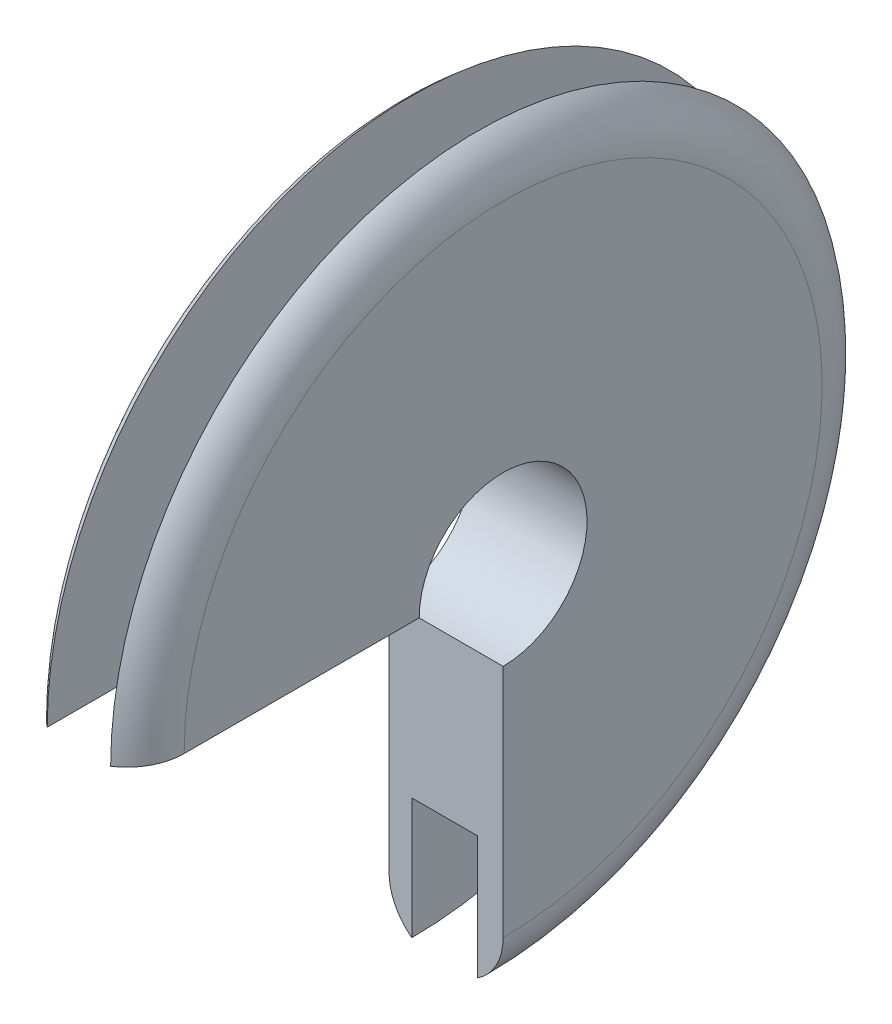
ISO-10303-21;
HEADER;
FILE_DESCRIPTION(('STEP AP214'),'2;1');
FILE_NAME('part.step','',(''),(''),'','','');
FILE_SCHEMA(('AUTOMOTIVE_DESIGN { 1 0 10303 214 1 1 1 1 }'));
ENDSEC;
DATA;
#1=APPLICATION_CONTEXT('core data for automotive mechanical design processes');
#2=APPLICATION_PROTOCOL_DEFINITION('international standard','automotive_design',2000,#1);
#3=PRODUCT_CONTEXT('',#1,'mechanical');
#4=PRODUCT('Part','Part','',(#3));
#5=PRODUCT_RELATED_PRODUCT_CATEGORY('part','',(#4));
#6=PRODUCT_DEFINITION_FORMATION('','',#4);
#7=PRODUCT_DEFINITION_CONTEXT('part definition',#1,'design');
#8=PRODUCT_DEFINITION('design','',#6,#7);
#9=PRODUCT_DEFINITION_SHAPE('','',#8);
#10=(LENGTH_UNIT() NAMED_UNIT(*) SI_UNIT(.MILLI.,.METRE.));
#11=(NAMED_UNIT(*) PLANE_ANGLE_UNIT() SI_UNIT($,.RADIAN.));
#12=(NAMED_UNIT(*) SI_UNIT($,.STERADIAN.) SOLID_ANGLE_UNIT());
#13=UNCERTAINTY_MEASURE_WITH_UNIT(LENGTH_MEASURE(1.E-05),#10,'distance_accuracy_value','');
#14=(GEOMETRIC_REPRESENTATION_CONTEXT(3) GLOBAL_UNCERTAINTY_ASSIGNED_CONTEXT((#13)) GLOBAL_UNIT_ASSIGNED_CONTEXT((#10,
#11,#12)) REPRESENTATION_CONTEXT('',''));
#15=CARTESIAN_POINT('',(0.,0.,0.));
#16=DIRECTION('',(0.,0.,1.));
#17=DIRECTION('',(1.,0.,0.));
#18=AXIS2_PLACEMENT_3D('',#15,#16,#17);
#19=CARTESIAN_POINT('',(0.,0.,0.));
#20=DIRECTION('',(-1.,0.,0.));
#21=DIRECTION('',(0.,0.,1.));
#22=AXIS2_PLACEMENT_3D('',#19,#20,#21);
#23=TOROIDAL_SURFACE('',#22,76.017373959772,13.5941620943285);
#24=CARTESIAN_POINT('',(-8.16366110818456,0.,0.));
#25=DIRECTION('',(1.,0.,0.));
#26=DIRECTION('',(0.,0.,-1.));
#27=AXIS2_PLACEMENT_3D('',#24,#25,#26);
#28=CIRCLE('',#27,86.8873270579962);
#29=CARTESIAN_POINT('',(-8.16366110818456,-86.8873270579962,3.03365481004954E-13));
#30=VERTEX_POINT('',#29);
#31=CARTESIAN_POINT('',(-8.16366110818456,-6.06730962009907E-13,86.8873270579962));
#32=VERTEX_POINT('',#31);
#33=EDGE_CURVE('E114',#30,#32,#28,.T.);
#34=ORIENTED_EDGE('',*,*,#33,.F.);
#35=CARTESIAN_POINT('',(0.,-76.017373959772,2.65413242608404E-13));
#36=DIRECTION('',(0.,0.,-1.));
#37=DIRECTION('',(0.,-1.,0.));
#38=AXIS2_PLACEMENT_3D('',#35,#36,#37);
#39=CIRCLE('',#38,13.5941620943285);
#40=CARTESIAN_POINT('',(-13.5941620943285,-76.0173739597721,2.65413242608404E-13));
#41=VERTEX_POINT('',#40);
#42=EDGE_CURVE('E135',#30,#41,#39,.T.);
#43=ORIENTED_EDGE('',*,*,#42,.T.);
#44=CARTESIAN_POINT('',(-13.5941620943285,0.,0.));
#45=DIRECTION('',(-1.,0.,0.));
#46=DIRECTION('',(0.,0.,1.));
#47=AXIS2_PLACEMENT_3D('',#44,#45,#46);
#48=CIRCLE('',#47,76.0173739597721);
#49=CARTESIAN_POINT('',(-13.5941620943285,-5.30826485216808E-13,76.0173739597721));
#50=VERTEX_POINT('',#49);
#51=EDGE_CURVE('E155',#50,#41,#48,.T.);
#52=ORIENTED_EDGE('',*,*,#51,.F.);
#53=CARTESIAN_POINT('',(0.,-5.30826485216808E-13,76.017373959772));
#54=DIRECTION('',(0.,-1.,0.));
#55=DIRECTION('',(0.,0.,1.));
#56=AXIS2_PLACEMENT_3D('',#53,#54,#55);
#57=CIRCLE('',#56,13.5941620943285);
#58=EDGE_CURVE('E146',#32,#50,#57,.T.);
#59=ORIENTED_EDGE('',*,*,#58,.F.);
#60=EDGE_LOOP('',(#34,#43,#52,#59));
#61=FACE_BOUND('',#60,.T.);
#62=ADVANCED_FACE('F37',(#61),#23,.T.);
#63=CARTESIAN_POINT('',(7.45377753355975,0.,0.));
#64=DIRECTION('',(-1.,0.,0.));
#65=DIRECTION('',(0.,0.,1.));
#66=AXIS2_PLACEMENT_3D('',#63,#64,#65);
#67=CIRCLE('',#66,87.3858586225174);
#68=CARTESIAN_POINT('',(7.45377753355975,-6.10212189318608E-13,87.3858586225174));
#69=VERTEX_POINT('',#68);
#70=CARTESIAN_POINT('',(7.45377753355975,-87.3858586225174,3.05106094659304E-13));
#71=VERTEX_POINT('',#70);
#72=EDGE_CURVE('E52',#69,#71,#67,.T.);
#73=ORIENTED_EDGE('',*,*,#72,.F.);
#74=CARTESIAN_POINT('',(13.5941620943285,-5.30826485216808E-13,76.0173739597721));
#75=VERTEX_POINT('',#74);
#76=EDGE_CURVE('E124',#75,#69,#57,.T.);
#77=ORIENTED_EDGE('',*,*,#76,.F.);
#78=CARTESIAN_POINT('',(13.5941620943285,0.,0.));
#79=DIRECTION('',(-1.,0.,0.));
#80=DIRECTION('',(0.,0.,1.));
#81=AXIS2_PLACEMENT_3D('',#78,#79,#80);
#82=CIRCLE('',#81,76.0173739597721);
#83=CARTESIAN_POINT('',(13.5941620943285,-76.0173739597721,2.65413242608404E-13));
#84=VERTEX_POINT('',#83);
#85=EDGE_CURVE('E153',#75,#84,#82,.T.);
#86=ORIENTED_EDGE('',*,*,#85,.T.);
#87=EDGE_CURVE('E136',#84,#71,#39,.T.);
#88=ORIENTED_EDGE('',*,*,#87,.T.);
#89=EDGE_LOOP('',(#73,#77,#86,#88));
#90=FACE_BOUND('',#89,.T.);
#91=ADVANCED_FACE('F181',(#90),#23,.T.);
#92=CARTESIAN_POINT('',(0.,-5.30826485216808E-13,76.017373959772));
#93=DIRECTION('',(0.,1.,0.));
#94=DIRECTION('',(0.,0.,1.));
#95=AXIS2_PLACEMENT_3D('',#92,#93,#94);
#96=PLANE('',#95);
#97=DIRECTION('',(0.,0.,-1.));
#98=VECTOR('',#97,1.);
#99=CARTESIAN_POINT('',(-8.16366110818456,-5.30826485216808E-13,76.017373959772));
#100=LINE('',#99,#98);
#101=CARTESIAN_POINT('',(-8.16366110818456,0.,58.0329822255726));
#102=VERTEX_POINT('',#101);
#103=EDGE_CURVE('E130',#32,#102,#100,.T.);
#104=ORIENTED_EDGE('',*,*,#103,.F.);
#105=ORIENTED_EDGE('',*,*,#58,.T.);
#106=DIRECTION('',(0.,0.,-1.));
#107=VECTOR('',#106,1.);
#108=CARTESIAN_POINT('',(-13.5941620943285,-5.30826485216808E-13,76.0173739597721));
#109=LINE('',#108,#107);
#110=CARTESIAN_POINT('',(-13.5941620943285,-1.39659253553725E-13,20.));
#111=VERTEX_POINT('',#110);
#112=EDGE_CURVE('E148',#50,#111,#109,.T.);
#113=ORIENTED_EDGE('',*,*,#112,.T.);
#114=DIRECTION('',(1.,0.,0.));
#115=VECTOR('',#114,1.);
#116=CARTESIAN_POINT('',(-13.5941620943285,-1.39659253553725E-13,20.));
#117=LINE('',#116,#115);
#118=CARTESIAN_POINT('',(13.5941620943285,-1.39659253553725E-13,20.));
#119=VERTEX_POINT('',#118);
#120=EDGE_CURVE('E151',#111,#119,#117,.T.);
#121=ORIENTED_EDGE('',*,*,#120,.T.);
#122=DIRECTION('',(0.,0.,1.));
#123=VECTOR('',#122,1.);
#124=CARTESIAN_POINT('',(13.5941620943285,-5.30826485216808E-13,76.0173739597721));
#125=LINE('',#124,#123);
#126=EDGE_CURVE('E144',#119,#75,#125,.T.);
#127=ORIENTED_EDGE('',*,*,#126,.T.);
#128=ORIENTED_EDGE('',*,*,#76,.T.);
#129=DIRECTION('',(0.,0.,1.));
#130=VECTOR('',#129,1.);
#131=CARTESIAN_POINT('',(7.45377753355975,-5.30826485216808E-13,76.017373959772));
#132=LINE('',#131,#130);
#133=CARTESIAN_POINT('',(7.45377753355975,-4.05242148956004E-13,58.0329822255726));
#134=VERTEX_POINT('',#133);
#135=EDGE_CURVE('E115',#134,#69,#132,.T.);
#136=ORIENTED_EDGE('',*,*,#135,.F.);
#137=DIRECTION('',(-1.,0.,0.));
#138=VECTOR('',#137,1.);
#139=CARTESIAN_POINT('',(-109.32207049221,-4.05242148956004E-13,58.0329822255726));
#140=LINE('',#139,#138);
#141=EDGE_CURVE('E104',#102,#134,#140,.F.);
#142=ORIENTED_EDGE('',*,*,#141,.F.);
#143=EDGE_LOOP('',(#104,#105,#113,#121,#127,#128,#136,#142));
#144=FACE_BOUND('',#143,.T.);
#145=ADVANCED_FACE('F121',(#144),#96,.F.);
#146=CARTESIAN_POINT('',(0.,-76.017373959772,2.65413242608404E-13));
#147=DIRECTION('',(0.,0.,1.));
#148=DIRECTION('',(0.,-1.,0.));
#149=AXIS2_PLACEMENT_3D('',#146,#147,#148);
#150=PLANE('',#149);
#151=ORIENTED_EDGE('',*,*,#42,.F.);
#152=DIRECTION('',(0.,1.,0.));
#153=VECTOR('',#152,1.);
#154=CARTESIAN_POINT('',(-8.16366110818456,-76.017373959772,2.65413242608404E-13));
#155=LINE('',#154,#153);
#156=CARTESIAN_POINT('',(-8.16366110818456,-58.0329822255726,2.02621074478002E-13));
#157=VERTEX_POINT('',#156);
#158=EDGE_CURVE('E11',#30,#157,#155,.T.);
#159=ORIENTED_EDGE('',*,*,#158,.T.);
#160=DIRECTION('',(-1.,0.,0.));
#161=VECTOR('',#160,1.);
#162=CARTESIAN_POINT('',(-109.32207049221,-58.0329822255726,2.02621074478002E-13));
#163=LINE('',#162,#161);
#164=CARTESIAN_POINT('',(7.45377753355975,-58.0329822255726,2.02621074478002E-13));
#165=VERTEX_POINT('',#164);
#166=EDGE_CURVE('E45',#157,#165,#163,.F.);
#167=ORIENTED_EDGE('',*,*,#166,.T.);
#168=DIRECTION('',(0.,-1.,0.));
#169=VECTOR('',#168,1.);
#170=CARTESIAN_POINT('',(7.45377753355975,-76.017373959772,2.65413242608404E-13));
#171=LINE('',#170,#169);
#172=EDGE_CURVE('E118',#165,#71,#171,.T.);
#173=ORIENTED_EDGE('',*,*,#172,.T.);
#174=ORIENTED_EDGE('',*,*,#87,.F.);
#175=DIRECTION('',(0.,-1.,0.));
#176=VECTOR('',#175,1.);
#177=CARTESIAN_POINT('',(13.5941620943285,-76.0173739597721,2.65413242608404E-13));
#178=LINE('',#177,#176);
#179=CARTESIAN_POINT('',(13.5941620943285,-20.,0.));
#180=VERTEX_POINT('',#179);
#181=EDGE_CURVE('E132',#180,#84,#178,.T.);
#182=ORIENTED_EDGE('',*,*,#181,.F.);
#183=DIRECTION('',(1.,0.,0.));
#184=VECTOR('',#183,1.);
#185=CARTESIAN_POINT('',(-13.5941620943285,-20.,0.));
#186=LINE('',#185,#184);
#187=CARTESIAN_POINT('',(-13.5941620943285,-20.,0.));
#188=VERTEX_POINT('',#187);
#189=EDGE_CURVE('E142',#188,#180,#186,.T.);
#190=ORIENTED_EDGE('',*,*,#189,.F.);
#191=DIRECTION('',(0.,1.,0.));
#192=VECTOR('',#191,1.);
#193=CARTESIAN_POINT('',(-13.5941620943285,-76.0173739597721,2.65413242608404E-13));
#194=LINE('',#193,#192);
#195=EDGE_CURVE('E139',#41,#188,#194,.T.);
#196=ORIENTED_EDGE('',*,*,#195,.F.);
#197=EDGE_LOOP('',(#151,#159,#167,#173,#174,#182,#190,#196));
#198=FACE_BOUND('',#197,.T.);
#199=ADVANCED_FACE('F163',(#198),#150,.T.);
#200=CARTESIAN_POINT('',(13.5941620943285,-5.30826485216808E-13,76.0173739597721));
#201=DIRECTION('',(-1.,0.,0.));
#202=DIRECTION('',(0.,0.,1.));
#203=AXIS2_PLACEMENT_3D('',#200,#201,#202);
#204=PLANE('',#203);
#205=CARTESIAN_POINT('',(13.5941620943285,0.,0.));
#206=DIRECTION('',(-1.,0.,0.));
#207=DIRECTION('',(0.,0.,1.));
#208=AXIS2_PLACEMENT_3D('',#205,#206,#207);
#209=CIRCLE('',#208,20.);
#210=EDGE_CURVE('E60',#119,#180,#209,.T.);
#211=ORIENTED_EDGE('',*,*,#210,.T.);
#212=ORIENTED_EDGE('',*,*,#181,.T.);
#213=ORIENTED_EDGE('',*,*,#85,.F.);
#214=ORIENTED_EDGE('',*,*,#126,.F.);
#215=EDGE_LOOP('',(#211,#212,#213,#214));
#216=FACE_BOUND('',#215,.T.);
#217=ADVANCED_FACE('F179',(#216),#204,.F.);
#218=CARTESIAN_POINT('',(-161.278786222658,0.,0.));
#219=DIRECTION('',(-1.,0.,0.));
#220=DIRECTION('',(0.,0.,1.));
#221=AXIS2_PLACEMENT_3D('',#218,#219,#220);
#222=CYLINDRICAL_SURFACE('',#221,20.);
#223=CARTESIAN_POINT('',(-13.5941620943285,0.,0.));
#224=DIRECTION('',(-1.,0.,0.));
#225=DIRECTION('',(0.,0.,1.));
#226=AXIS2_PLACEMENT_3D('',#223,#224,#225);
#227=CIRCLE('',#226,20.);
#228=EDGE_CURVE('E158',#111,#188,#227,.T.);
#229=ORIENTED_EDGE('',*,*,#228,.T.);
#230=ORIENTED_EDGE('',*,*,#189,.T.);
#231=ORIENTED_EDGE('',*,*,#210,.F.);
#232=ORIENTED_EDGE('',*,*,#120,.F.);
#233=EDGE_LOOP('',(#229,#230,#231,#232));
#234=FACE_BOUND('',#233,.T.);
#235=ADVANCED_FACE('F39',(#234),#222,.F.);
#236=CARTESIAN_POINT('',(-13.5941620943285,-5.30826485216808E-13,76.0173739597721));
#237=DIRECTION('',(1.,0.,0.));
#238=DIRECTION('',(0.,0.,-1.));
#239=AXIS2_PLACEMENT_3D('',#236,#237,#238);
#240=PLANE('',#239);
#241=ORIENTED_EDGE('',*,*,#51,.T.);
#242=ORIENTED_EDGE('',*,*,#195,.T.);
#243=ORIENTED_EDGE('',*,*,#228,.F.);
#244=ORIENTED_EDGE('',*,*,#112,.F.);
#245=EDGE_LOOP('',(#241,#242,#243,#244));
#246=FACE_BOUND('',#245,.T.);
#247=ADVANCED_FACE('F174',(#246),#240,.F.);
#248=CARTESIAN_POINT('',(-8.16366110818456,104.530356363493,0.));
#249=DIRECTION('',(1.,0.,0.));
#250=DIRECTION('',(0.,0.,-1.));
#251=AXIS2_PLACEMENT_3D('',#248,#249,#250);
#252=PLANE('',#251);
#253=ORIENTED_EDGE('',*,*,#103,.T.);
#254=CARTESIAN_POINT('',(-8.16366110818456,0.,0.));
#255=DIRECTION('',(-1.,0.,0.));
#256=DIRECTION('',(0.,0.,1.));
#257=AXIS2_PLACEMENT_3D('',#254,#255,#256);
#258=CIRCLE('',#257,58.0329822255726);
#259=EDGE_CURVE('E110',#102,#157,#258,.T.);
#260=ORIENTED_EDGE('',*,*,#259,.T.);
#261=ORIENTED_EDGE('',*,*,#158,.F.);
#262=ORIENTED_EDGE('',*,*,#33,.T.);
#263=EDGE_LOOP('',(#253,#260,#261,#262));
#264=FACE_BOUND('',#263,.T.);
#265=ADVANCED_FACE('F166',(#264),#252,.T.);
#266=CARTESIAN_POINT('',(-109.32207049221,0.,0.));
#267=DIRECTION('',(-1.,0.,0.));
#268=DIRECTION('',(0.,0.,1.));
#269=AXIS2_PLACEMENT_3D('',#266,#267,#268);
#270=CYLINDRICAL_SURFACE('',#269,58.0329822255726);
#271=ORIENTED_EDGE('',*,*,#141,.T.);
#272=CARTESIAN_POINT('',(7.45377753355975,0.,0.));
#273=DIRECTION('',(-1.,0.,0.));
#274=DIRECTION('',(0.,0.,1.));
#275=AXIS2_PLACEMENT_3D('',#272,#273,#274);
#276=CIRCLE('',#275,58.0329822255726);
#277=EDGE_CURVE('E107',#134,#165,#276,.T.);
#278=ORIENTED_EDGE('',*,*,#277,.T.);
#279=ORIENTED_EDGE('',*,*,#166,.F.);
#280=ORIENTED_EDGE('',*,*,#259,.F.);
#281=EDGE_LOOP('',(#271,#278,#279,#280));
#282=FACE_BOUND('',#281,.T.);
#283=ADVANCED_FACE('F106',(#282),#270,.T.);
#284=CARTESIAN_POINT('',(7.45377753355975,104.530356363493,0.));
#285=DIRECTION('',(-1.,0.,0.));
#286=DIRECTION('',(0.,0.,1.));
#287=AXIS2_PLACEMENT_3D('',#284,#285,#286);
#288=PLANE('',#287);
#289=ORIENTED_EDGE('',*,*,#135,.T.);
#290=ORIENTED_EDGE('',*,*,#72,.T.);
#291=ORIENTED_EDGE('',*,*,#172,.F.);
#292=ORIENTED_EDGE('',*,*,#277,.F.);
#293=EDGE_LOOP('',(#289,#290,#291,#292));
#294=FACE_BOUND('',#293,.T.);
#295=ADVANCED_FACE('F117',(#294),#288,.T.);
#296=CLOSED_SHELL('',(#62,#91,#145,#199,#217,#235,#247,#265,#283,#295));
#297=MANIFOLD_SOLID_BREP('B2',#296);
#298=ADVANCED_BREP_SHAPE_REPRESENTATION('',(#18,#297),#14);
#299=SHAPE_DEFINITION_REPRESENTATION(#9,#298);
ENDSEC;
END-ISO-10303-21;
